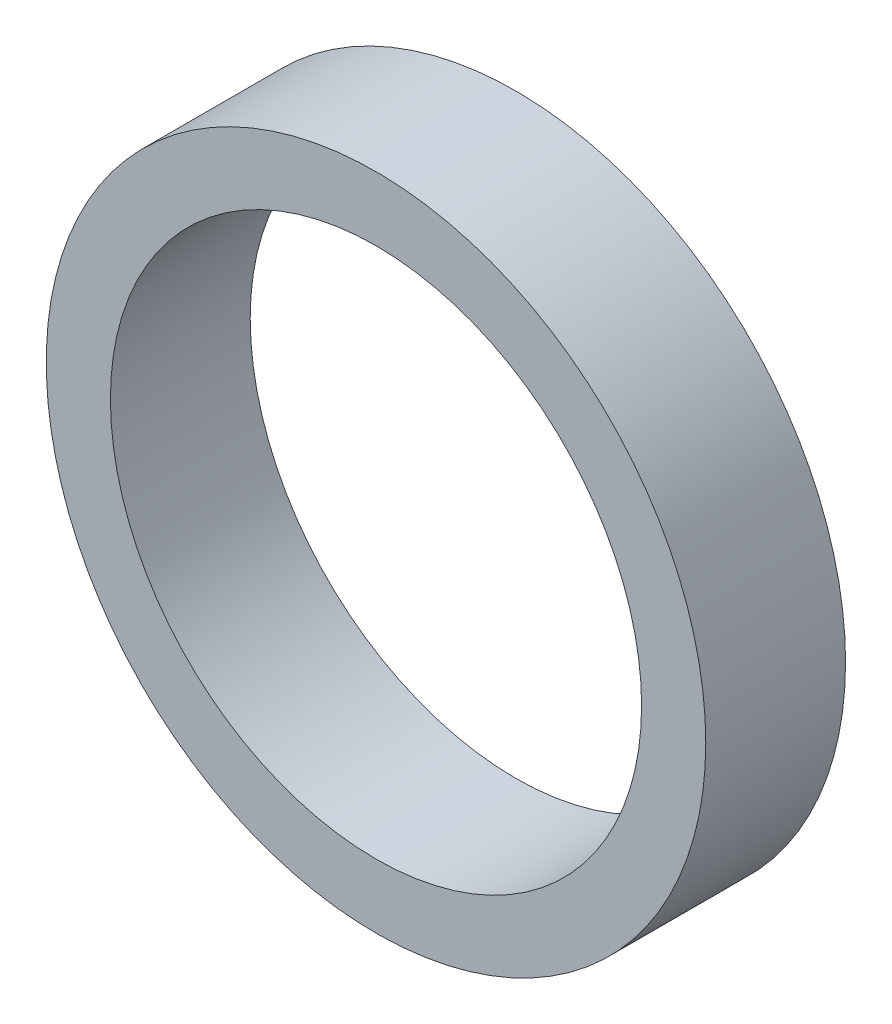
ISO-10303-21;
HEADER;
FILE_DESCRIPTION(('STEP AP214'),'2;1');
FILE_NAME('part.step','',(''),(''),'','','');
FILE_SCHEMA(('AUTOMOTIVE_DESIGN { 1 0 10303 214 1 1 1 1 }'));
ENDSEC;
DATA;
#1=APPLICATION_CONTEXT('core data for automotive mechanical design processes');
#2=APPLICATION_PROTOCOL_DEFINITION('international standard','automotive_design',2000,#1);
#3=PRODUCT_CONTEXT('',#1,'mechanical');
#4=PRODUCT('Part','Part','',(#3));
#5=PRODUCT_RELATED_PRODUCT_CATEGORY('part','',(#4));
#6=PRODUCT_DEFINITION_FORMATION('','',#4);
#7=PRODUCT_DEFINITION_CONTEXT('part definition',#1,'design');
#8=PRODUCT_DEFINITION('design','',#6,#7);
#9=PRODUCT_DEFINITION_SHAPE('','',#8);
#10=(LENGTH_UNIT() NAMED_UNIT(*) SI_UNIT(.MILLI.,.METRE.));
#11=(NAMED_UNIT(*) PLANE_ANGLE_UNIT() SI_UNIT($,.RADIAN.));
#12=(NAMED_UNIT(*) SI_UNIT($,.STERADIAN.) SOLID_ANGLE_UNIT());
#13=UNCERTAINTY_MEASURE_WITH_UNIT(LENGTH_MEASURE(1.E-05),#10,'distance_accuracy_value','');
#14=(GEOMETRIC_REPRESENTATION_CONTEXT(3) GLOBAL_UNCERTAINTY_ASSIGNED_CONTEXT((#13)) GLOBAL_UNIT_ASSIGNED_CONTEXT((#10,
#11,#12)) REPRESENTATION_CONTEXT('',''));
#15=CARTESIAN_POINT('',(0.,0.,0.));
#16=DIRECTION('',(0.,0.,1.));
#17=DIRECTION('',(1.,0.,0.));
#18=AXIS2_PLACEMENT_3D('',#15,#16,#17);
#19=CARTESIAN_POINT('',(0.,0.,10.));
#20=DIRECTION('',(0.,0.,1.));
#21=DIRECTION('',(1.,0.,0.));
#22=AXIS2_PLACEMENT_3D('',#19,#20,#21);
#23=PLANE('',#22);
#24=CARTESIAN_POINT('',(0.,0.,10.));
#25=DIRECTION('',(0.,0.,1.));
#26=DIRECTION('',(1.,0.,0.));
#27=AXIS2_PLACEMENT_3D('',#24,#25,#26);
#28=CIRCLE('',#27,23.59);
#29=CARTESIAN_POINT('',(23.59,0.,10.));
#30=VERTEX_POINT('',#29);
#31=EDGE_CURVE('E10',#30,#30,#28,.T.);
#32=ORIENTED_EDGE('',*,*,#31,.T.);
#33=EDGE_LOOP('',(#32));
#34=FACE_BOUND('',#33,.T.);
#35=CARTESIAN_POINT('',(0.,0.,10.));
#36=DIRECTION('',(0.,0.,1.));
#37=DIRECTION('',(1.,0.,0.));
#38=AXIS2_PLACEMENT_3D('',#35,#36,#37);
#39=CIRCLE('',#38,19.);
#40=CARTESIAN_POINT('',(19.,0.,10.));
#41=VERTEX_POINT('',#40);
#42=EDGE_CURVE('E50',#41,#41,#39,.T.);
#43=ORIENTED_EDGE('',*,*,#42,.F.);
#44=EDGE_LOOP('',(#43));
#45=FACE_BOUND('',#44,.T.);
#46=ADVANCED_FACE('F37',(#34,#45),#23,.T.);
#47=CARTESIAN_POINT('',(0.,0.,0.));
#48=DIRECTION('',(0.,0.,1.));
#49=DIRECTION('',(1.,0.,0.));
#50=AXIS2_PLACEMENT_3D('',#47,#48,#49);
#51=PLANE('',#50);
#52=CARTESIAN_POINT('',(0.,0.,0.));
#53=DIRECTION('',(0.,0.,1.));
#54=DIRECTION('',(1.,0.,0.));
#55=AXIS2_PLACEMENT_3D('',#52,#53,#54);
#56=CIRCLE('',#55,23.59);
#57=CARTESIAN_POINT('',(23.59,0.,0.));
#58=VERTEX_POINT('',#57);
#59=EDGE_CURVE('E41',#58,#58,#56,.T.);
#60=ORIENTED_EDGE('',*,*,#59,.F.);
#61=EDGE_LOOP('',(#60));
#62=FACE_BOUND('',#61,.T.);
#63=CARTESIAN_POINT('',(0.,0.,0.));
#64=DIRECTION('',(0.,0.,1.));
#65=DIRECTION('',(1.,0.,0.));
#66=AXIS2_PLACEMENT_3D('',#63,#64,#65);
#67=CIRCLE('',#66,19.);
#68=CARTESIAN_POINT('',(19.,0.,0.));
#69=VERTEX_POINT('',#68);
#70=EDGE_CURVE('E52',#69,#69,#67,.T.);
#71=ORIENTED_EDGE('',*,*,#70,.T.);
#72=EDGE_LOOP('',(#71));
#73=FACE_BOUND('',#72,.T.);
#74=ADVANCED_FACE('F64',(#62,#73),#51,.F.);
#75=CARTESIAN_POINT('',(0.,0.,10.));
#76=DIRECTION('',(0.,0.,-1.));
#77=DIRECTION('',(-1.,0.,0.));
#78=AXIS2_PLACEMENT_3D('',#75,#76,#77);
#79=CYLINDRICAL_SURFACE('',#78,23.59);
#80=ORIENTED_EDGE('',*,*,#31,.F.);
#81=EDGE_LOOP('',(#80));
#82=FACE_BOUND('',#81,.T.);
#83=ORIENTED_EDGE('',*,*,#59,.T.);
#84=EDGE_LOOP('',(#83));
#85=FACE_BOUND('',#84,.T.);
#86=ADVANCED_FACE('F39',(#82,#85),#79,.T.);
#87=CARTESIAN_POINT('',(0.,0.,10.));
#88=DIRECTION('',(0.,0.,-1.));
#89=DIRECTION('',(-1.,0.,0.));
#90=AXIS2_PLACEMENT_3D('',#87,#88,#89);
#91=CYLINDRICAL_SURFACE('',#90,19.);
#92=ORIENTED_EDGE('',*,*,#42,.T.);
#93=EDGE_LOOP('',(#92));
#94=FACE_BOUND('',#93,.T.);
#95=ORIENTED_EDGE('',*,*,#70,.F.);
#96=EDGE_LOOP('',(#95));
#97=FACE_BOUND('',#96,.T.);
#98=ADVANCED_FACE('F60',(#94,#97),#91,.F.);
#99=CLOSED_SHELL('',(#46,#74,#86,#98));
#100=MANIFOLD_SOLID_BREP('B2',#99);
#101=ADVANCED_BREP_SHAPE_REPRESENTATION('',(#18,#100),#14);
#102=SHAPE_DEFINITION_REPRESENTATION(#9,#101);
ENDSEC;
END-ISO-10303-21;
